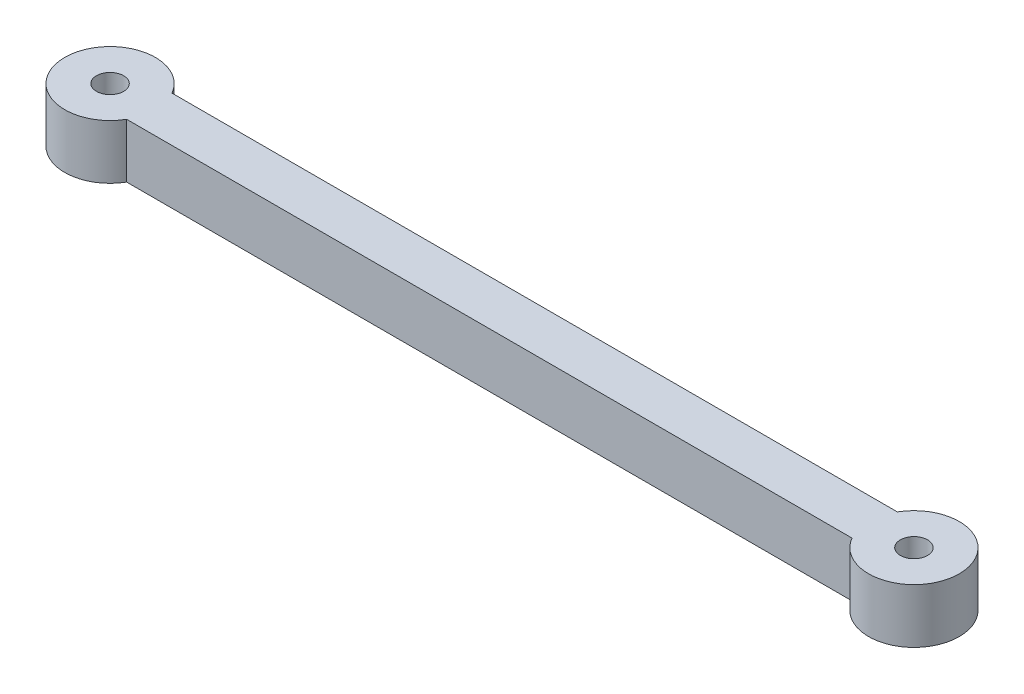
ISO-10303-21;
HEADER;
FILE_DESCRIPTION(('STEP AP214'),'2;1');
FILE_NAME('part.step','',(''),(''),'','','');
FILE_SCHEMA(('AUTOMOTIVE_DESIGN { 1 0 10303 214 1 1 1 1 }'));
ENDSEC;
DATA;
#1=APPLICATION_CONTEXT('core data for automotive mechanical design processes');
#2=APPLICATION_PROTOCOL_DEFINITION('international standard','automotive_design',2000,#1);
#3=PRODUCT_CONTEXT('',#1,'mechanical');
#4=PRODUCT('Part','Part','',(#3));
#5=PRODUCT_RELATED_PRODUCT_CATEGORY('part','',(#4));
#6=PRODUCT_DEFINITION_FORMATION('','',#4);
#7=PRODUCT_DEFINITION_CONTEXT('part definition',#1,'design');
#8=PRODUCT_DEFINITION('design','',#6,#7);
#9=PRODUCT_DEFINITION_SHAPE('','',#8);
#10=(LENGTH_UNIT() NAMED_UNIT(*) SI_UNIT(.MILLI.,.METRE.));
#11=(NAMED_UNIT(*) PLANE_ANGLE_UNIT() SI_UNIT($,.RADIAN.));
#12=(NAMED_UNIT(*) SI_UNIT($,.STERADIAN.) SOLID_ANGLE_UNIT());
#13=UNCERTAINTY_MEASURE_WITH_UNIT(LENGTH_MEASURE(1.E-05),#10,'distance_accuracy_value','');
#14=(GEOMETRIC_REPRESENTATION_CONTEXT(3) GLOBAL_UNCERTAINTY_ASSIGNED_CONTEXT((#13)) GLOBAL_UNIT_ASSIGNED_CONTEXT((#10,
#11,#12)) REPRESENTATION_CONTEXT('',''));
#15=CARTESIAN_POINT('',(0.,0.,0.));
#16=DIRECTION('',(0.,0.,1.));
#17=DIRECTION('',(1.,0.,0.));
#18=AXIS2_PLACEMENT_3D('',#15,#16,#17);
#19=CARTESIAN_POINT('',(-44.3301270189222,6.,0.));
#20=DIRECTION('',(0.,-1.,0.));
#21=DIRECTION('',(0.,0.,-1.));
#22=AXIS2_PLACEMENT_3D('',#19,#20,#21);
#23=CYLINDRICAL_SURFACE('',#22,5.);
#24=CARTESIAN_POINT('',(-44.3301270189222,0.,0.));
#25=DIRECTION('',(0.,1.,0.));
#26=DIRECTION('',(0.,0.,1.));
#27=AXIS2_PLACEMENT_3D('',#24,#25,#26);
#28=CIRCLE('',#27,5.);
#29=CARTESIAN_POINT('',(-40.,0.,-2.5));
#30=VERTEX_POINT('',#29);
#31=CARTESIAN_POINT('',(-40.,0.,2.5));
#32=VERTEX_POINT('',#31);
#33=EDGE_CURVE('E96',#30,#32,#28,.T.);
#34=ORIENTED_EDGE('',*,*,#33,.T.);
#35=DIRECTION('',(0.,-1.,0.));
#36=VECTOR('',#35,1.);
#37=CARTESIAN_POINT('',(-40.,6.,2.5));
#38=LINE('',#37,#36);
#39=CARTESIAN_POINT('',(-40.,6.,2.5));
#40=VERTEX_POINT('',#39);
#41=EDGE_CURVE('E11',#40,#32,#38,.T.);
#42=ORIENTED_EDGE('',*,*,#41,.F.);
#43=CARTESIAN_POINT('',(-44.3301270189222,6.,0.));
#44=DIRECTION('',(0.,1.,0.));
#45=DIRECTION('',(0.,0.,1.));
#46=AXIS2_PLACEMENT_3D('',#43,#44,#45);
#47=CIRCLE('',#46,5.);
#48=CARTESIAN_POINT('',(-40.,6.,-2.5));
#49=VERTEX_POINT('',#48);
#50=EDGE_CURVE('E84',#49,#40,#47,.T.);
#51=ORIENTED_EDGE('',*,*,#50,.F.);
#52=DIRECTION('',(0.,-1.,0.));
#53=VECTOR('',#52,1.);
#54=CARTESIAN_POINT('',(-40.,6.,-2.5));
#55=LINE('',#54,#53);
#56=EDGE_CURVE('E92',#49,#30,#55,.T.);
#57=ORIENTED_EDGE('',*,*,#56,.T.);
#58=EDGE_LOOP('',(#34,#42,#51,#57));
#59=FACE_BOUND('',#58,.T.);
#60=ADVANCED_FACE('F33',(#59),#23,.T.);
#61=CARTESIAN_POINT('',(-40.,6.,2.5));
#62=DIRECTION('',(0.,0.,-1.));
#63=DIRECTION('',(-1.,0.,0.));
#64=AXIS2_PLACEMENT_3D('',#61,#62,#63);
#65=PLANE('',#64);
#66=DIRECTION('',(1.,0.,0.));
#67=VECTOR('',#66,1.);
#68=CARTESIAN_POINT('',(-40.,0.,2.5));
#69=LINE('',#68,#67);
#70=CARTESIAN_POINT('',(40.,0.,2.50000000000001));
#71=VERTEX_POINT('',#70);
#72=EDGE_CURVE('E88',#32,#71,#69,.T.);
#73=ORIENTED_EDGE('',*,*,#72,.T.);
#74=DIRECTION('',(0.,-1.,0.));
#75=VECTOR('',#74,1.);
#76=CARTESIAN_POINT('',(40.,6.,2.50000000000001));
#77=LINE('',#76,#75);
#78=CARTESIAN_POINT('',(40.,6.,2.50000000000001));
#79=VERTEX_POINT('',#78);
#80=EDGE_CURVE('E41',#79,#71,#77,.T.);
#81=ORIENTED_EDGE('',*,*,#80,.F.);
#82=DIRECTION('',(1.,0.,0.));
#83=VECTOR('',#82,1.);
#84=CARTESIAN_POINT('',(-40.,6.,2.5));
#85=LINE('',#84,#83);
#86=EDGE_CURVE('E79',#40,#79,#85,.T.);
#87=ORIENTED_EDGE('',*,*,#86,.F.);
#88=ORIENTED_EDGE('',*,*,#41,.T.);
#89=EDGE_LOOP('',(#73,#81,#87,#88));
#90=FACE_BOUND('',#89,.T.);
#91=ADVANCED_FACE('F87',(#90),#65,.F.);
#92=CARTESIAN_POINT('',(44.3301270189222,6.,0.));
#93=DIRECTION('',(0.,-1.,0.));
#94=DIRECTION('',(0.,0.,-1.));
#95=AXIS2_PLACEMENT_3D('',#92,#93,#94);
#96=CYLINDRICAL_SURFACE('',#95,5.);
#97=CARTESIAN_POINT('',(44.3301270189222,0.,0.));
#98=DIRECTION('',(0.,1.,0.));
#99=DIRECTION('',(0.,0.,-1.));
#100=AXIS2_PLACEMENT_3D('',#97,#98,#99);
#101=CIRCLE('',#100,5.);
#102=CARTESIAN_POINT('',(40.,0.,-2.5));
#103=VERTEX_POINT('',#102);
#104=EDGE_CURVE('E66',#71,#103,#101,.T.);
#105=ORIENTED_EDGE('',*,*,#104,.T.);
#106=DIRECTION('',(0.,-1.,0.));
#107=VECTOR('',#106,1.);
#108=CARTESIAN_POINT('',(40.,6.,-2.5));
#109=LINE('',#108,#107);
#110=CARTESIAN_POINT('',(40.,6.,-2.5));
#111=VERTEX_POINT('',#110);
#112=EDGE_CURVE('E89',#111,#103,#109,.T.);
#113=ORIENTED_EDGE('',*,*,#112,.F.);
#114=CARTESIAN_POINT('',(44.3301270189222,6.,0.));
#115=DIRECTION('',(0.,1.,0.));
#116=DIRECTION('',(0.,0.,-1.));
#117=AXIS2_PLACEMENT_3D('',#114,#115,#116);
#118=CIRCLE('',#117,5.);
#119=EDGE_CURVE('E82',#79,#111,#118,.T.);
#120=ORIENTED_EDGE('',*,*,#119,.F.);
#121=ORIENTED_EDGE('',*,*,#80,.T.);
#122=EDGE_LOOP('',(#105,#113,#120,#121));
#123=FACE_BOUND('',#122,.T.);
#124=ADVANCED_FACE('F90',(#123),#96,.T.);
#125=CARTESIAN_POINT('',(-40.,6.,-2.5));
#126=DIRECTION('',(0.,0.,1.));
#127=DIRECTION('',(1.,0.,0.));
#128=AXIS2_PLACEMENT_3D('',#125,#126,#127);
#129=PLANE('',#128);
#130=DIRECTION('',(-1.,0.,0.));
#131=VECTOR('',#130,1.);
#132=CARTESIAN_POINT('',(-40.,0.,-2.5));
#133=LINE('',#132,#131);
#134=EDGE_CURVE('E72',#103,#30,#133,.T.);
#135=ORIENTED_EDGE('',*,*,#134,.T.);
#136=ORIENTED_EDGE('',*,*,#56,.F.);
#137=DIRECTION('',(-1.,0.,0.));
#138=VECTOR('',#137,1.);
#139=CARTESIAN_POINT('',(-40.,6.,-2.5));
#140=LINE('',#139,#138);
#141=EDGE_CURVE('E49',#111,#49,#140,.T.);
#142=ORIENTED_EDGE('',*,*,#141,.F.);
#143=ORIENTED_EDGE('',*,*,#112,.T.);
#144=EDGE_LOOP('',(#135,#136,#142,#143));
#145=FACE_BOUND('',#144,.T.);
#146=ADVANCED_FACE('F104',(#145),#129,.F.);
#147=CARTESIAN_POINT('',(-44.3301270189222,6.,0.));
#148=DIRECTION('',(0.,1.,0.));
#149=DIRECTION('',(0.,0.,1.));
#150=AXIS2_PLACEMENT_3D('',#147,#148,#149);
#151=PLANE('',#150);
#152=CARTESIAN_POINT('',(-44.3301270189222,6.,0.));
#153=DIRECTION('',(0.,1.,0.));
#154=DIRECTION('',(0.,0.,1.));
#155=AXIS2_PLACEMENT_3D('',#152,#153,#154);
#156=CIRCLE('',#155,1.5);
#157=CARTESIAN_POINT('',(-44.3301270189222,6.,1.5));
#158=VERTEX_POINT('',#157);
#159=EDGE_CURVE('E116',#158,#158,#156,.T.);
#160=ORIENTED_EDGE('',*,*,#159,.F.);
#161=EDGE_LOOP('',(#160));
#162=FACE_BOUND('',#161,.T.);
#163=CARTESIAN_POINT('',(44.3301270189222,6.,0.));
#164=DIRECTION('',(0.,1.,0.));
#165=DIRECTION('',(0.,0.,1.));
#166=AXIS2_PLACEMENT_3D('',#163,#164,#165);
#167=CIRCLE('',#166,1.5);
#168=CARTESIAN_POINT('',(44.3301270189222,6.,1.5));
#169=VERTEX_POINT('',#168);
#170=EDGE_CURVE('E110',#169,#169,#167,.T.);
#171=ORIENTED_EDGE('',*,*,#170,.F.);
#172=EDGE_LOOP('',(#171));
#173=FACE_BOUND('',#172,.T.);
#174=ORIENTED_EDGE('',*,*,#50,.T.);
#175=ORIENTED_EDGE('',*,*,#86,.T.);
#176=ORIENTED_EDGE('',*,*,#119,.T.);
#177=ORIENTED_EDGE('',*,*,#141,.T.);
#178=EDGE_LOOP('',(#174,#175,#176,#177));
#179=FACE_BOUND('',#178,.T.);
#180=ADVANCED_FACE('F80',(#162,#173,#179),#151,.T.);
#181=CARTESIAN_POINT('',(-44.3301270189222,0.,0.));
#182=DIRECTION('',(0.,1.,0.));
#183=DIRECTION('',(0.,0.,1.));
#184=AXIS2_PLACEMENT_3D('',#181,#182,#183);
#185=PLANE('',#184);
#186=CARTESIAN_POINT('',(-44.3301270189222,0.,0.));
#187=DIRECTION('',(0.,1.,0.));
#188=DIRECTION('',(0.,0.,1.));
#189=AXIS2_PLACEMENT_3D('',#186,#187,#188);
#190=CIRCLE('',#189,1.5);
#191=CARTESIAN_POINT('',(-44.3301270189222,0.,1.5));
#192=VERTEX_POINT('',#191);
#193=EDGE_CURVE('E99',#192,#192,#190,.T.);
#194=ORIENTED_EDGE('',*,*,#193,.T.);
#195=EDGE_LOOP('',(#194));
#196=FACE_BOUND('',#195,.T.);
#197=CARTESIAN_POINT('',(44.3301270189222,0.,0.));
#198=DIRECTION('',(0.,1.,0.));
#199=DIRECTION('',(0.,0.,1.));
#200=AXIS2_PLACEMENT_3D('',#197,#198,#199);
#201=CIRCLE('',#200,1.5);
#202=CARTESIAN_POINT('',(44.3301270189222,0.,1.5));
#203=VERTEX_POINT('',#202);
#204=EDGE_CURVE('E113',#203,#203,#201,.T.);
#205=ORIENTED_EDGE('',*,*,#204,.T.);
#206=EDGE_LOOP('',(#205));
#207=FACE_BOUND('',#206,.T.);
#208=ORIENTED_EDGE('',*,*,#33,.F.);
#209=ORIENTED_EDGE('',*,*,#134,.F.);
#210=ORIENTED_EDGE('',*,*,#104,.F.);
#211=ORIENTED_EDGE('',*,*,#72,.F.);
#212=EDGE_LOOP('',(#208,#209,#210,#211));
#213=FACE_BOUND('',#212,.T.);
#214=ADVANCED_FACE('F107',(#196,#207,#213),#185,.F.);
#215=CARTESIAN_POINT('',(44.3301270189222,0.,0.));
#216=DIRECTION('',(0.,1.,0.));
#217=DIRECTION('',(0.,0.,1.));
#218=AXIS2_PLACEMENT_3D('',#215,#216,#217);
#219=CYLINDRICAL_SURFACE('',#218,1.5);
#220=ORIENTED_EDGE('',*,*,#204,.F.);
#221=EDGE_LOOP('',(#220));
#222=FACE_BOUND('',#221,.T.);
#223=ORIENTED_EDGE('',*,*,#170,.T.);
#224=EDGE_LOOP('',(#223));
#225=FACE_BOUND('',#224,.T.);
#226=ADVANCED_FACE('F127',(#222,#225),#219,.F.);
#227=CARTESIAN_POINT('',(-44.3301270189222,0.,0.));
#228=DIRECTION('',(0.,1.,0.));
#229=DIRECTION('',(0.,0.,1.));
#230=AXIS2_PLACEMENT_3D('',#227,#228,#229);
#231=CYLINDRICAL_SURFACE('',#230,1.5);
#232=ORIENTED_EDGE('',*,*,#193,.F.);
#233=EDGE_LOOP('',(#232));
#234=FACE_BOUND('',#233,.T.);
#235=ORIENTED_EDGE('',*,*,#159,.T.);
#236=EDGE_LOOP('',(#235));
#237=FACE_BOUND('',#236,.T.);
#238=ADVANCED_FACE('F124',(#234,#237),#231,.F.);
#239=CLOSED_SHELL('',(#60,#91,#124,#146,#180,#214,#226,#238));
#240=MANIFOLD_SOLID_BREP('B2',#239);
#241=ADVANCED_BREP_SHAPE_REPRESENTATION('',(#18,#240),#14);
#242=SHAPE_DEFINITION_REPRESENTATION(#9,#241);
ENDSEC;
END-ISO-10303-21;
